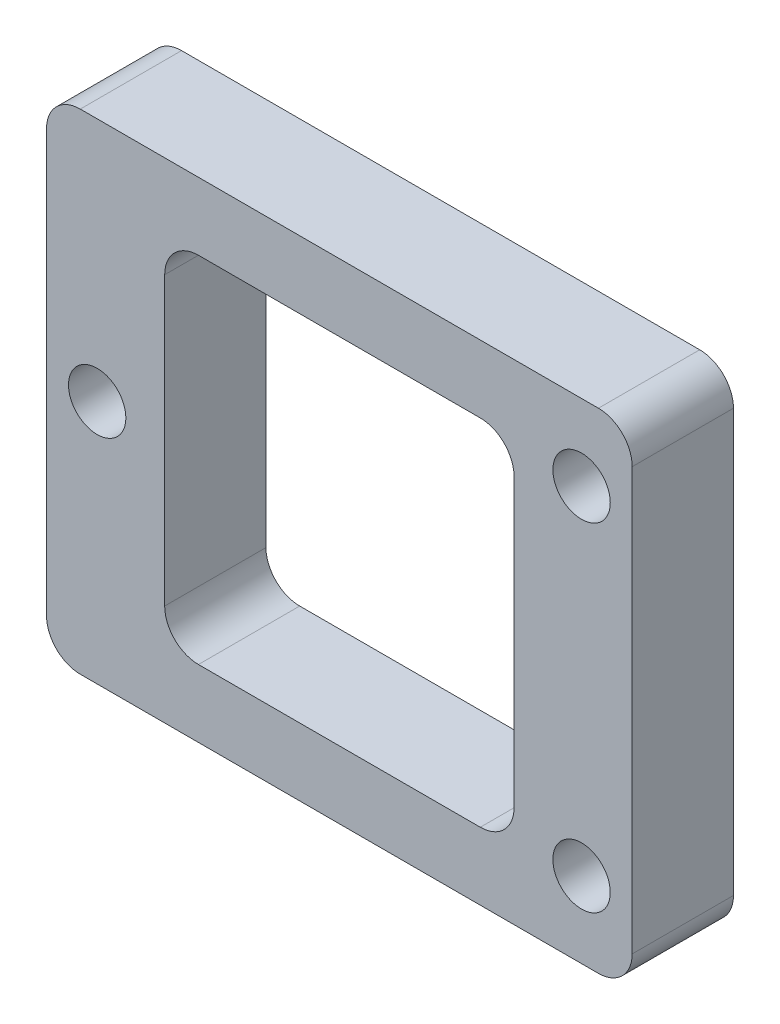
ISO-10303-21;
HEADER;
FILE_DESCRIPTION(('STEP AP214'),'2;1');
FILE_NAME('part.step','',(''),(''),'','','');
FILE_SCHEMA(('AUTOMOTIVE_DESIGN { 1 0 10303 214 1 1 1 1 }'));
ENDSEC;
DATA;
#1=APPLICATION_CONTEXT('core data for automotive mechanical design processes');
#2=APPLICATION_PROTOCOL_DEFINITION('international standard','automotive_design',2000,#1);
#3=PRODUCT_CONTEXT('',#1,'mechanical');
#4=PRODUCT('Part','Part','',(#3));
#5=PRODUCT_RELATED_PRODUCT_CATEGORY('part','',(#4));
#6=PRODUCT_DEFINITION_FORMATION('','',#4);
#7=PRODUCT_DEFINITION_CONTEXT('part definition',#1,'design');
#8=PRODUCT_DEFINITION('design','',#6,#7);
#9=PRODUCT_DEFINITION_SHAPE('','',#8);
#10=(LENGTH_UNIT() NAMED_UNIT(*) SI_UNIT(.MILLI.,.METRE.));
#11=(NAMED_UNIT(*) PLANE_ANGLE_UNIT() SI_UNIT($,.RADIAN.));
#12=(NAMED_UNIT(*) SI_UNIT($,.STERADIAN.) SOLID_ANGLE_UNIT());
#13=UNCERTAINTY_MEASURE_WITH_UNIT(LENGTH_MEASURE(1.E-05),#10,'distance_accuracy_value','');
#14=(GEOMETRIC_REPRESENTATION_CONTEXT(3) GLOBAL_UNCERTAINTY_ASSIGNED_CONTEXT((#13)) GLOBAL_UNIT_ASSIGNED_CONTEXT((#10,
#11,#12)) REPRESENTATION_CONTEXT('',''));
#15=CARTESIAN_POINT('',(0.,0.,0.));
#16=DIRECTION('',(0.,0.,1.));
#17=DIRECTION('',(1.,0.,0.));
#18=AXIS2_PLACEMENT_3D('',#15,#16,#17);
#19=CARTESIAN_POINT('',(17.35,-14.5,6.));
#20=DIRECTION('',(-1.,0.,0.));
#21=DIRECTION('',(0.,0.,1.));
#22=AXIS2_PLACEMENT_3D('',#19,#20,#21);
#23=PLANE('',#22);
#24=DIRECTION('',(0.,1.,0.));
#25=VECTOR('',#24,1.);
#26=CARTESIAN_POINT('',(17.35,-14.5,6.));
#27=LINE('',#26,#25);
#28=CARTESIAN_POINT('',(17.35,-12.5,6.));
#29=VERTEX_POINT('',#28);
#30=CARTESIAN_POINT('',(17.35,12.5,6.));
#31=VERTEX_POINT('',#30);
#32=EDGE_CURVE('E241',#29,#31,#27,.T.);
#33=ORIENTED_EDGE('',*,*,#32,.F.);
#34=DIRECTION('',(0.,0.,-1.));
#35=VECTOR('',#34,1.);
#36=CARTESIAN_POINT('',(17.35,-12.5,6.));
#37=LINE('',#36,#35);
#38=CARTESIAN_POINT('',(17.35,-12.5,0.));
#39=VERTEX_POINT('',#38);
#40=EDGE_CURVE('E183',#29,#39,#37,.T.);
#41=ORIENTED_EDGE('',*,*,#40,.T.);
#42=DIRECTION('',(0.,1.,0.));
#43=VECTOR('',#42,1.);
#44=CARTESIAN_POINT('',(17.35,-14.5,0.));
#45=LINE('',#44,#43);
#46=CARTESIAN_POINT('',(17.35,12.5,0.));
#47=VERTEX_POINT('',#46);
#48=EDGE_CURVE('E231',#39,#47,#45,.T.);
#49=ORIENTED_EDGE('',*,*,#48,.T.);
#50=DIRECTION('',(0.,0.,-1.));
#51=VECTOR('',#50,1.);
#52=CARTESIAN_POINT('',(17.35,12.5,6.));
#53=LINE('',#52,#51);
#54=EDGE_CURVE('E180',#47,#31,#53,.F.);
#55=ORIENTED_EDGE('',*,*,#54,.T.);
#56=EDGE_LOOP('',(#33,#41,#49,#55));
#57=FACE_BOUND('',#56,.T.);
#58=ADVANCED_FACE('F35',(#57),#23,.F.);
#59=CARTESIAN_POINT('',(-17.35,14.5,6.));
#60=DIRECTION('',(0.,-1.,0.));
#61=DIRECTION('',(0.,0.,-1.));
#62=AXIS2_PLACEMENT_3D('',#59,#60,#61);
#63=PLANE('',#62);
#64=DIRECTION('',(-1.,0.,0.));
#65=VECTOR('',#64,1.);
#66=CARTESIAN_POINT('',(-17.35,14.5,0.));
#67=LINE('',#66,#65);
#68=CARTESIAN_POINT('',(15.35,14.5,0.));
#69=VERTEX_POINT('',#68);
#70=CARTESIAN_POINT('',(-15.35,14.5,0.));
#71=VERTEX_POINT('',#70);
#72=EDGE_CURVE('E221',#69,#71,#67,.T.);
#73=ORIENTED_EDGE('',*,*,#72,.T.);
#74=DIRECTION('',(0.,0.,-1.));
#75=VECTOR('',#74,1.);
#76=CARTESIAN_POINT('',(-15.35,14.5,6.));
#77=LINE('',#76,#75);
#78=CARTESIAN_POINT('',(-15.35,14.5,6.));
#79=VERTEX_POINT('',#78);
#80=EDGE_CURVE('E11',#71,#79,#77,.F.);
#81=ORIENTED_EDGE('',*,*,#80,.T.);
#82=DIRECTION('',(-1.,0.,0.));
#83=VECTOR('',#82,1.);
#84=CARTESIAN_POINT('',(-17.35,14.5,6.));
#85=LINE('',#84,#83);
#86=CARTESIAN_POINT('',(15.35,14.5,6.));
#87=VERTEX_POINT('',#86);
#88=EDGE_CURVE('E223',#87,#79,#85,.T.);
#89=ORIENTED_EDGE('',*,*,#88,.F.);
#90=DIRECTION('',(0.,0.,-1.));
#91=VECTOR('',#90,1.);
#92=CARTESIAN_POINT('',(15.35,14.5,6.));
#93=LINE('',#92,#91);
#94=EDGE_CURVE('E43',#87,#69,#93,.T.);
#95=ORIENTED_EDGE('',*,*,#94,.T.);
#96=EDGE_LOOP('',(#73,#81,#89,#95));
#97=FACE_BOUND('',#96,.T.);
#98=ADVANCED_FACE('F220',(#97),#63,.F.);
#99=CARTESIAN_POINT('',(-17.35,-14.5,6.));
#100=DIRECTION('',(1.,0.,0.));
#101=DIRECTION('',(0.,0.,-1.));
#102=AXIS2_PLACEMENT_3D('',#99,#100,#101);
#103=PLANE('',#102);
#104=DIRECTION('',(0.,-1.,0.));
#105=VECTOR('',#104,1.);
#106=CARTESIAN_POINT('',(-17.35,-14.5,0.));
#107=LINE('',#106,#105);
#108=CARTESIAN_POINT('',(-17.35,12.5,0.));
#109=VERTEX_POINT('',#108);
#110=CARTESIAN_POINT('',(-17.35,-12.5,0.));
#111=VERTEX_POINT('',#110);
#112=EDGE_CURVE('E230',#109,#111,#107,.T.);
#113=ORIENTED_EDGE('',*,*,#112,.T.);
#114=DIRECTION('',(0.,0.,-1.));
#115=VECTOR('',#114,1.);
#116=CARTESIAN_POINT('',(-17.35,-12.5,6.));
#117=LINE('',#116,#115);
#118=CARTESIAN_POINT('',(-17.35,-12.5,6.));
#119=VERTEX_POINT('',#118);
#120=EDGE_CURVE('E50',#111,#119,#117,.F.);
#121=ORIENTED_EDGE('',*,*,#120,.T.);
#122=DIRECTION('',(0.,-1.,0.));
#123=VECTOR('',#122,1.);
#124=CARTESIAN_POINT('',(-17.35,-14.5,6.));
#125=LINE('',#124,#123);
#126=CARTESIAN_POINT('',(-17.35,12.5,6.));
#127=VERTEX_POINT('',#126);
#128=EDGE_CURVE('E316',#127,#119,#125,.T.);
#129=ORIENTED_EDGE('',*,*,#128,.F.);
#130=DIRECTION('',(0.,0.,-1.));
#131=VECTOR('',#130,1.);
#132=CARTESIAN_POINT('',(-17.35,12.5,6.));
#133=LINE('',#132,#131);
#134=EDGE_CURVE('E211',#127,#109,#133,.T.);
#135=ORIENTED_EDGE('',*,*,#134,.T.);
#136=EDGE_LOOP('',(#113,#121,#129,#135));
#137=FACE_BOUND('',#136,.T.);
#138=ADVANCED_FACE('F334',(#137),#103,.F.);
#139=CARTESIAN_POINT('',(-17.35,-14.5,6.));
#140=DIRECTION('',(0.,1.,0.));
#141=DIRECTION('',(0.,0.,1.));
#142=AXIS2_PLACEMENT_3D('',#139,#140,#141);
#143=PLANE('',#142);
#144=DIRECTION('',(1.,0.,0.));
#145=VECTOR('',#144,1.);
#146=CARTESIAN_POINT('',(-17.35,-14.5,0.));
#147=LINE('',#146,#145);
#148=CARTESIAN_POINT('',(-15.35,-14.5,0.));
#149=VERTEX_POINT('',#148);
#150=CARTESIAN_POINT('',(15.35,-14.5,0.));
#151=VERTEX_POINT('',#150);
#152=EDGE_CURVE('E233',#149,#151,#147,.T.);
#153=ORIENTED_EDGE('',*,*,#152,.T.);
#154=DIRECTION('',(0.,0.,-1.));
#155=VECTOR('',#154,1.);
#156=CARTESIAN_POINT('',(15.35,-14.5,6.));
#157=LINE('',#156,#155);
#158=CARTESIAN_POINT('',(15.35,-14.5,6.));
#159=VERTEX_POINT('',#158);
#160=EDGE_CURVE('E202',#151,#159,#157,.F.);
#161=ORIENTED_EDGE('',*,*,#160,.T.);
#162=DIRECTION('',(1.,0.,0.));
#163=VECTOR('',#162,1.);
#164=CARTESIAN_POINT('',(-17.35,-14.5,6.));
#165=LINE('',#164,#163);
#166=CARTESIAN_POINT('',(-15.35,-14.5,6.));
#167=VERTEX_POINT('',#166);
#168=EDGE_CURVE('E252',#167,#159,#165,.T.);
#169=ORIENTED_EDGE('',*,*,#168,.F.);
#170=DIRECTION('',(0.,0.,-1.));
#171=VECTOR('',#170,1.);
#172=CARTESIAN_POINT('',(-15.35,-14.5,6.));
#173=LINE('',#172,#171);
#174=EDGE_CURVE('E199',#167,#149,#173,.T.);
#175=ORIENTED_EDGE('',*,*,#174,.T.);
#176=EDGE_LOOP('',(#153,#161,#169,#175));
#177=FACE_BOUND('',#176,.T.);
#178=ADVANCED_FACE('F331',(#177),#143,.F.);
#179=CARTESIAN_POINT('',(0.,0.,6.));
#180=DIRECTION('',(0.,0.,-1.));
#181=DIRECTION('',(-1.,0.,0.));
#182=AXIS2_PLACEMENT_3D('',#179,#180,#181);
#183=PLANE('',#182);
#184=DIRECTION('',(-1.,0.,0.));
#185=VECTOR('',#184,1.);
#186=CARTESIAN_POINT('',(-10.35,10.5,6.));
#187=LINE('',#186,#185);
#188=CARTESIAN_POINT('',(8.35,10.5,6.));
#189=VERTEX_POINT('',#188);
#190=CARTESIAN_POINT('',(-8.35,10.5,6.));
#191=VERTEX_POINT('',#190);
#192=EDGE_CURVE('E305',#189,#191,#187,.T.);
#193=ORIENTED_EDGE('',*,*,#192,.F.);
#194=CARTESIAN_POINT('',(8.35,8.5,6.));
#195=DIRECTION('',(0.,0.,-1.));
#196=DIRECTION('',(-1.,0.,0.));
#197=AXIS2_PLACEMENT_3D('',#194,#195,#196);
#198=CIRCLE('',#197,2.);
#199=CARTESIAN_POINT('',(10.35,8.5,6.));
#200=VERTEX_POINT('',#199);
#201=EDGE_CURVE('E274',#189,#200,#198,.T.);
#202=ORIENTED_EDGE('',*,*,#201,.T.);
#203=DIRECTION('',(0.,1.,0.));
#204=VECTOR('',#203,1.);
#205=CARTESIAN_POINT('',(10.35,-10.5,6.));
#206=LINE('',#205,#204);
#207=CARTESIAN_POINT('',(10.35,-8.5,6.));
#208=VERTEX_POINT('',#207);
#209=EDGE_CURVE('E297',#208,#200,#206,.T.);
#210=ORIENTED_EDGE('',*,*,#209,.F.);
#211=CARTESIAN_POINT('',(8.35,-8.5,6.));
#212=DIRECTION('',(0.,0.,-1.));
#213=DIRECTION('',(-1.,0.,0.));
#214=AXIS2_PLACEMENT_3D('',#211,#212,#213);
#215=CIRCLE('',#214,2.);
#216=CARTESIAN_POINT('',(8.35,-10.5,6.));
#217=VERTEX_POINT('',#216);
#218=EDGE_CURVE('E278',#208,#217,#215,.T.);
#219=ORIENTED_EDGE('',*,*,#218,.T.);
#220=DIRECTION('',(1.,0.,0.));
#221=VECTOR('',#220,1.);
#222=CARTESIAN_POINT('',(-10.35,-10.5,6.));
#223=LINE('',#222,#221);
#224=CARTESIAN_POINT('',(-8.35,-10.5,6.));
#225=VERTEX_POINT('',#224);
#226=EDGE_CURVE('E296',#225,#217,#223,.T.);
#227=ORIENTED_EDGE('',*,*,#226,.F.);
#228=CARTESIAN_POINT('',(-8.35,-8.5,6.));
#229=DIRECTION('',(0.,0.,-1.));
#230=DIRECTION('',(-1.,0.,0.));
#231=AXIS2_PLACEMENT_3D('',#228,#229,#230);
#232=CIRCLE('',#231,2.);
#233=CARTESIAN_POINT('',(-10.35,-8.5,6.));
#234=VERTEX_POINT('',#233);
#235=EDGE_CURVE('E181',#225,#234,#232,.T.);
#236=ORIENTED_EDGE('',*,*,#235,.T.);
#237=DIRECTION('',(0.,-1.,0.));
#238=VECTOR('',#237,1.);
#239=CARTESIAN_POINT('',(-10.35,-10.5,6.));
#240=LINE('',#239,#238);
#241=CARTESIAN_POINT('',(-10.35,8.5,6.));
#242=VERTEX_POINT('',#241);
#243=EDGE_CURVE('E157',#242,#234,#240,.T.);
#244=ORIENTED_EDGE('',*,*,#243,.F.);
#245=CARTESIAN_POINT('',(-8.35,8.5,6.));
#246=DIRECTION('',(0.,0.,-1.));
#247=DIRECTION('',(-1.,0.,0.));
#248=AXIS2_PLACEMENT_3D('',#245,#246,#247);
#249=CIRCLE('',#248,2.);
#250=EDGE_CURVE('E271',#242,#191,#249,.T.);
#251=ORIENTED_EDGE('',*,*,#250,.T.);
#252=EDGE_LOOP('',(#193,#202,#210,#219,#227,#236,#244,#251));
#253=FACE_BOUND('',#252,.T.);
#254=CARTESIAN_POINT('',(14.35,-9.99999999999999,6.));
#255=DIRECTION('',(0.,0.,1.));
#256=DIRECTION('',(1.,0.,0.));
#257=AXIS2_PLACEMENT_3D('',#254,#255,#256);
#258=CIRCLE('',#257,1.7);
#259=CARTESIAN_POINT('',(16.05,-9.99999999999999,6.));
#260=VERTEX_POINT('',#259);
#261=EDGE_CURVE('E246',#260,#260,#258,.T.);
#262=ORIENTED_EDGE('',*,*,#261,.F.);
#263=EDGE_LOOP('',(#262));
#264=FACE_BOUND('',#263,.T.);
#265=CARTESIAN_POINT('',(-14.35,0.,6.));
#266=DIRECTION('',(0.,0.,1.));
#267=DIRECTION('',(1.,0.,0.));
#268=AXIS2_PLACEMENT_3D('',#265,#266,#267);
#269=CIRCLE('',#268,1.7);
#270=CARTESIAN_POINT('',(-12.65,0.,6.));
#271=VERTEX_POINT('',#270);
#272=EDGE_CURVE('E303',#271,#271,#269,.T.);
#273=ORIENTED_EDGE('',*,*,#272,.F.);
#274=EDGE_LOOP('',(#273));
#275=FACE_BOUND('',#274,.T.);
#276=CARTESIAN_POINT('',(14.35,10.,6.));
#277=DIRECTION('',(0.,0.,1.));
#278=DIRECTION('',(1.,0.,0.));
#279=AXIS2_PLACEMENT_3D('',#276,#277,#278);
#280=CIRCLE('',#279,1.7);
#281=CARTESIAN_POINT('',(16.05,10.,6.));
#282=VERTEX_POINT('',#281);
#283=EDGE_CURVE('E300',#282,#282,#280,.T.);
#284=ORIENTED_EDGE('',*,*,#283,.F.);
#285=EDGE_LOOP('',(#284));
#286=FACE_BOUND('',#285,.T.);
#287=ORIENTED_EDGE('',*,*,#168,.T.);
#288=CARTESIAN_POINT('',(15.35,-12.5,6.));
#289=DIRECTION('',(0.,0.,-1.));
#290=DIRECTION('',(-1.,0.,0.));
#291=AXIS2_PLACEMENT_3D('',#288,#289,#290);
#292=CIRCLE('',#291,2.);
#293=EDGE_CURVE('E209',#159,#29,#292,.F.);
#294=ORIENTED_EDGE('',*,*,#293,.T.);
#295=ORIENTED_EDGE('',*,*,#32,.T.);
#296=CARTESIAN_POINT('',(15.35,12.5,6.));
#297=DIRECTION('',(0.,0.,-1.));
#298=DIRECTION('',(-1.,0.,0.));
#299=AXIS2_PLACEMENT_3D('',#296,#297,#298);
#300=CIRCLE('',#299,2.);
#301=EDGE_CURVE('E204',#31,#87,#300,.F.);
#302=ORIENTED_EDGE('',*,*,#301,.T.);
#303=ORIENTED_EDGE('',*,*,#88,.T.);
#304=CARTESIAN_POINT('',(-15.35,12.5,6.));
#305=DIRECTION('',(0.,0.,-1.));
#306=DIRECTION('',(-1.,0.,0.));
#307=AXIS2_PLACEMENT_3D('',#304,#305,#306);
#308=CIRCLE('',#307,2.);
#309=EDGE_CURVE('E57',#79,#127,#308,.F.);
#310=ORIENTED_EDGE('',*,*,#309,.T.);
#311=ORIENTED_EDGE('',*,*,#128,.T.);
#312=CARTESIAN_POINT('',(-15.35,-12.5,6.));
#313=DIRECTION('',(0.,0.,-1.));
#314=DIRECTION('',(-1.,0.,0.));
#315=AXIS2_PLACEMENT_3D('',#312,#313,#314);
#316=CIRCLE('',#315,2.);
#317=EDGE_CURVE('E207',#119,#167,#316,.F.);
#318=ORIENTED_EDGE('',*,*,#317,.T.);
#319=EDGE_LOOP('',(#287,#294,#295,#302,#303,#310,#311,#318));
#320=FACE_BOUND('',#319,.T.);
#321=ADVANCED_FACE('F294',(#253,#264,#275,#286,#320),#183,.F.);
#322=CARTESIAN_POINT('',(0.,0.,0.));
#323=DIRECTION('',(0.,0.,-1.));
#324=DIRECTION('',(-1.,0.,0.));
#325=AXIS2_PLACEMENT_3D('',#322,#323,#324);
#326=PLANE('',#325);
#327=DIRECTION('',(0.,-1.,0.));
#328=VECTOR('',#327,1.);
#329=CARTESIAN_POINT('',(10.35,0.,0.));
#330=LINE('',#329,#328);
#331=CARTESIAN_POINT('',(10.35,8.5,0.));
#332=VERTEX_POINT('',#331);
#333=CARTESIAN_POINT('',(10.35,-8.5,0.));
#334=VERTEX_POINT('',#333);
#335=EDGE_CURVE('E161',#332,#334,#330,.T.);
#336=ORIENTED_EDGE('',*,*,#335,.F.);
#337=CARTESIAN_POINT('',(8.35,8.5,0.));
#338=DIRECTION('',(0.,0.,-1.));
#339=DIRECTION('',(-1.,0.,0.));
#340=AXIS2_PLACEMENT_3D('',#337,#338,#339);
#341=CIRCLE('',#340,2.);
#342=CARTESIAN_POINT('',(8.35,10.5,0.));
#343=VERTEX_POINT('',#342);
#344=EDGE_CURVE('E276',#332,#343,#341,.F.);
#345=ORIENTED_EDGE('',*,*,#344,.T.);
#346=DIRECTION('',(1.,0.,0.));
#347=VECTOR('',#346,1.);
#348=CARTESIAN_POINT('',(0.,10.5,0.));
#349=LINE('',#348,#347);
#350=CARTESIAN_POINT('',(-8.35,10.5,0.));
#351=VERTEX_POINT('',#350);
#352=EDGE_CURVE('E174',#351,#343,#349,.T.);
#353=ORIENTED_EDGE('',*,*,#352,.F.);
#354=CARTESIAN_POINT('',(-8.35,8.5,0.));
#355=DIRECTION('',(0.,0.,-1.));
#356=DIRECTION('',(-1.,0.,0.));
#357=AXIS2_PLACEMENT_3D('',#354,#355,#356);
#358=CIRCLE('',#357,2.);
#359=CARTESIAN_POINT('',(-10.35,8.5,0.));
#360=VERTEX_POINT('',#359);
#361=EDGE_CURVE('E172',#351,#360,#358,.F.);
#362=ORIENTED_EDGE('',*,*,#361,.T.);
#363=DIRECTION('',(0.,1.,0.));
#364=VECTOR('',#363,1.);
#365=CARTESIAN_POINT('',(-10.35,0.,0.));
#366=LINE('',#365,#364);
#367=CARTESIAN_POINT('',(-10.35,-8.5,0.));
#368=VERTEX_POINT('',#367);
#369=EDGE_CURVE('E154',#368,#360,#366,.T.);
#370=ORIENTED_EDGE('',*,*,#369,.F.);
#371=CARTESIAN_POINT('',(-8.35,-8.5,0.));
#372=DIRECTION('',(0.,0.,-1.));
#373=DIRECTION('',(-1.,0.,0.));
#374=AXIS2_PLACEMENT_3D('',#371,#372,#373);
#375=CIRCLE('',#374,2.);
#376=CARTESIAN_POINT('',(-8.35,-10.5,0.));
#377=VERTEX_POINT('',#376);
#378=EDGE_CURVE('E168',#368,#377,#375,.F.);
#379=ORIENTED_EDGE('',*,*,#378,.T.);
#380=DIRECTION('',(-1.,0.,0.));
#381=VECTOR('',#380,1.);
#382=CARTESIAN_POINT('',(0.,-10.5,0.));
#383=LINE('',#382,#381);
#384=CARTESIAN_POINT('',(8.35,-10.5,0.));
#385=VERTEX_POINT('',#384);
#386=EDGE_CURVE('E173',#385,#377,#383,.T.);
#387=ORIENTED_EDGE('',*,*,#386,.F.);
#388=CARTESIAN_POINT('',(8.35,-8.5,0.));
#389=DIRECTION('',(0.,0.,-1.));
#390=DIRECTION('',(-1.,0.,0.));
#391=AXIS2_PLACEMENT_3D('',#388,#389,#390);
#392=CIRCLE('',#391,2.);
#393=EDGE_CURVE('E185',#385,#334,#392,.F.);
#394=ORIENTED_EDGE('',*,*,#393,.T.);
#395=EDGE_LOOP('',(#336,#345,#353,#362,#370,#379,#387,#394));
#396=FACE_BOUND('',#395,.T.);
#397=CARTESIAN_POINT('',(14.35,-9.99999999999999,0.));
#398=DIRECTION('',(0.,0.,-1.));
#399=DIRECTION('',(-1.,0.,0.));
#400=AXIS2_PLACEMENT_3D('',#397,#398,#399);
#401=CIRCLE('',#400,1.7);
#402=CARTESIAN_POINT('',(12.65,-9.99999999999999,0.));
#403=VERTEX_POINT('',#402);
#404=EDGE_CURVE('E235',#403,#403,#401,.T.);
#405=ORIENTED_EDGE('',*,*,#404,.F.);
#406=EDGE_LOOP('',(#405));
#407=FACE_BOUND('',#406,.T.);
#408=CARTESIAN_POINT('',(-14.35,0.,0.));
#409=DIRECTION('',(0.,0.,-1.));
#410=DIRECTION('',(-1.,0.,0.));
#411=AXIS2_PLACEMENT_3D('',#408,#409,#410);
#412=CIRCLE('',#411,1.7);
#413=CARTESIAN_POINT('',(-16.05,0.,0.));
#414=VERTEX_POINT('',#413);
#415=EDGE_CURVE('E245',#414,#414,#412,.T.);
#416=ORIENTED_EDGE('',*,*,#415,.F.);
#417=EDGE_LOOP('',(#416));
#418=FACE_BOUND('',#417,.T.);
#419=CARTESIAN_POINT('',(14.35,10.,0.));
#420=DIRECTION('',(0.,0.,-1.));
#421=DIRECTION('',(-1.,0.,0.));
#422=AXIS2_PLACEMENT_3D('',#419,#420,#421);
#423=CIRCLE('',#422,1.7);
#424=CARTESIAN_POINT('',(12.65,10.,0.));
#425=VERTEX_POINT('',#424);
#426=EDGE_CURVE('E242',#425,#425,#423,.T.);
#427=ORIENTED_EDGE('',*,*,#426,.F.);
#428=EDGE_LOOP('',(#427));
#429=FACE_BOUND('',#428,.T.);
#430=ORIENTED_EDGE('',*,*,#48,.F.);
#431=CARTESIAN_POINT('',(15.35,-12.5,0.));
#432=DIRECTION('',(0.,0.,-1.));
#433=DIRECTION('',(-1.,0.,0.));
#434=AXIS2_PLACEMENT_3D('',#431,#432,#433);
#435=CIRCLE('',#434,2.);
#436=EDGE_CURVE('E197',#39,#151,#435,.T.);
#437=ORIENTED_EDGE('',*,*,#436,.T.);
#438=ORIENTED_EDGE('',*,*,#152,.F.);
#439=CARTESIAN_POINT('',(-15.35,-12.5,0.));
#440=DIRECTION('',(0.,0.,-1.));
#441=DIRECTION('',(-1.,0.,0.));
#442=AXIS2_PLACEMENT_3D('',#439,#440,#441);
#443=CIRCLE('',#442,2.);
#444=EDGE_CURVE('E195',#149,#111,#443,.T.);
#445=ORIENTED_EDGE('',*,*,#444,.T.);
#446=ORIENTED_EDGE('',*,*,#112,.F.);
#447=CARTESIAN_POINT('',(-15.35,12.5,0.));
#448=DIRECTION('',(0.,0.,-1.));
#449=DIRECTION('',(-1.,0.,0.));
#450=AXIS2_PLACEMENT_3D('',#447,#448,#449);
#451=CIRCLE('',#450,2.);
#452=EDGE_CURVE('E193',#109,#71,#451,.T.);
#453=ORIENTED_EDGE('',*,*,#452,.T.);
#454=ORIENTED_EDGE('',*,*,#72,.F.);
#455=CARTESIAN_POINT('',(15.35,12.5,0.));
#456=DIRECTION('',(0.,0.,-1.));
#457=DIRECTION('',(-1.,0.,0.));
#458=AXIS2_PLACEMENT_3D('',#455,#456,#457);
#459=CIRCLE('',#458,2.);
#460=EDGE_CURVE('E191',#69,#47,#459,.T.);
#461=ORIENTED_EDGE('',*,*,#460,.T.);
#462=EDGE_LOOP('',(#430,#437,#438,#445,#446,#453,#454,#461));
#463=FACE_BOUND('',#462,.T.);
#464=ADVANCED_FACE('F165',(#396,#407,#418,#429,#463),#326,.T.);
#465=CARTESIAN_POINT('',(14.35,10.,-19.));
#466=DIRECTION('',(0.,0.,1.));
#467=DIRECTION('',(1.,0.,0.));
#468=AXIS2_PLACEMENT_3D('',#465,#466,#467);
#469=CYLINDRICAL_SURFACE('',#468,1.7);
#470=ORIENTED_EDGE('',*,*,#426,.T.);
#471=EDGE_LOOP('',(#470));
#472=FACE_BOUND('',#471,.T.);
#473=ORIENTED_EDGE('',*,*,#283,.T.);
#474=EDGE_LOOP('',(#473));
#475=FACE_BOUND('',#474,.T.);
#476=ADVANCED_FACE('F454',(#472,#475),#469,.F.);
#477=CARTESIAN_POINT('',(-14.35,0.,-19.));
#478=DIRECTION('',(0.,0.,1.));
#479=DIRECTION('',(1.,0.,0.));
#480=AXIS2_PLACEMENT_3D('',#477,#478,#479);
#481=CYLINDRICAL_SURFACE('',#480,1.7);
#482=ORIENTED_EDGE('',*,*,#415,.T.);
#483=EDGE_LOOP('',(#482));
#484=FACE_BOUND('',#483,.T.);
#485=ORIENTED_EDGE('',*,*,#272,.T.);
#486=EDGE_LOOP('',(#485));
#487=FACE_BOUND('',#486,.T.);
#488=ADVANCED_FACE('F445',(#484,#487),#481,.F.);
#489=CARTESIAN_POINT('',(14.35,-9.99999999999999,-19.));
#490=DIRECTION('',(0.,0.,1.));
#491=DIRECTION('',(1.,0.,0.));
#492=AXIS2_PLACEMENT_3D('',#489,#490,#491);
#493=CYLINDRICAL_SURFACE('',#492,1.7);
#494=ORIENTED_EDGE('',*,*,#404,.T.);
#495=EDGE_LOOP('',(#494));
#496=FACE_BOUND('',#495,.T.);
#497=ORIENTED_EDGE('',*,*,#261,.T.);
#498=EDGE_LOOP('',(#497));
#499=FACE_BOUND('',#498,.T.);
#500=ADVANCED_FACE('F437',(#496,#499),#493,.F.);
#501=CARTESIAN_POINT('',(10.35,-10.5,-4.));
#502=DIRECTION('',(1.,0.,0.));
#503=DIRECTION('',(0.,1.,0.));
#504=AXIS2_PLACEMENT_3D('',#501,#502,#503);
#505=PLANE('',#504);
#506=ORIENTED_EDGE('',*,*,#209,.T.);
#507=DIRECTION('',(0.,0.,1.));
#508=VECTOR('',#507,1.);
#509=CARTESIAN_POINT('',(10.35,8.5,0.));
#510=LINE('',#509,#508);
#511=EDGE_CURVE('E266',#200,#332,#510,.F.);
#512=ORIENTED_EDGE('',*,*,#511,.T.);
#513=ORIENTED_EDGE('',*,*,#335,.T.);
#514=DIRECTION('',(0.,0.,1.));
#515=VECTOR('',#514,1.);
#516=CARTESIAN_POINT('',(10.35,-8.5,6.));
#517=LINE('',#516,#515);
#518=EDGE_CURVE('E263',#334,#208,#517,.T.);
#519=ORIENTED_EDGE('',*,*,#518,.T.);
#520=EDGE_LOOP('',(#506,#512,#513,#519));
#521=FACE_BOUND('',#520,.T.);
#522=ADVANCED_FACE('F286',(#521),#505,.F.);
#523=CARTESIAN_POINT('',(-10.35,-10.5,-4.));
#524=DIRECTION('',(0.,-1.,0.));
#525=DIRECTION('',(0.,0.,-1.));
#526=AXIS2_PLACEMENT_3D('',#523,#524,#525);
#527=PLANE('',#526);
#528=ORIENTED_EDGE('',*,*,#226,.T.);
#529=DIRECTION('',(0.,0.,1.));
#530=VECTOR('',#529,1.);
#531=CARTESIAN_POINT('',(8.35,-10.5,0.));
#532=LINE('',#531,#530);
#533=EDGE_CURVE('E269',#217,#385,#532,.F.);
#534=ORIENTED_EDGE('',*,*,#533,.T.);
#535=ORIENTED_EDGE('',*,*,#386,.T.);
#536=DIRECTION('',(0.,0.,1.));
#537=VECTOR('',#536,1.);
#538=CARTESIAN_POINT('',(-8.35,-10.5,6.));
#539=LINE('',#538,#537);
#540=EDGE_CURVE('E179',#377,#225,#539,.T.);
#541=ORIENTED_EDGE('',*,*,#540,.T.);
#542=EDGE_LOOP('',(#528,#534,#535,#541));
#543=FACE_BOUND('',#542,.T.);
#544=ADVANCED_FACE('F299',(#543),#527,.F.);
#545=CARTESIAN_POINT('',(-10.35,-10.5,-4.));
#546=DIRECTION('',(-1.,0.,0.));
#547=DIRECTION('',(0.,0.,1.));
#548=AXIS2_PLACEMENT_3D('',#545,#546,#547);
#549=PLANE('',#548);
#550=ORIENTED_EDGE('',*,*,#369,.T.);
#551=DIRECTION('',(0.,0.,1.));
#552=VECTOR('',#551,1.);
#553=CARTESIAN_POINT('',(-10.35,8.5,6.));
#554=LINE('',#553,#552);
#555=EDGE_CURVE('E160',#360,#242,#554,.T.);
#556=ORIENTED_EDGE('',*,*,#555,.T.);
#557=ORIENTED_EDGE('',*,*,#243,.T.);
#558=DIRECTION('',(0.,0.,1.));
#559=VECTOR('',#558,1.);
#560=CARTESIAN_POINT('',(-10.35,-8.5,0.));
#561=LINE('',#560,#559);
#562=EDGE_CURVE('E150',#234,#368,#561,.F.);
#563=ORIENTED_EDGE('',*,*,#562,.T.);
#564=EDGE_LOOP('',(#550,#556,#557,#563));
#565=FACE_BOUND('',#564,.T.);
#566=ADVANCED_FACE('F152',(#565),#549,.F.);
#567=CARTESIAN_POINT('',(-10.35,10.5,-4.));
#568=DIRECTION('',(0.,1.,0.));
#569=DIRECTION('',(0.,0.,1.));
#570=AXIS2_PLACEMENT_3D('',#567,#568,#569);
#571=PLANE('',#570);
#572=ORIENTED_EDGE('',*,*,#192,.T.);
#573=DIRECTION('',(0.,0.,1.));
#574=VECTOR('',#573,1.);
#575=CARTESIAN_POINT('',(-8.35,10.5,0.));
#576=LINE('',#575,#574);
#577=EDGE_CURVE('E261',#191,#351,#576,.F.);
#578=ORIENTED_EDGE('',*,*,#577,.T.);
#579=ORIENTED_EDGE('',*,*,#352,.T.);
#580=DIRECTION('',(0.,0.,1.));
#581=VECTOR('',#580,1.);
#582=CARTESIAN_POINT('',(8.35,10.5,6.));
#583=LINE('',#582,#581);
#584=EDGE_CURVE('E258',#343,#189,#583,.T.);
#585=ORIENTED_EDGE('',*,*,#584,.T.);
#586=EDGE_LOOP('',(#572,#578,#579,#585));
#587=FACE_BOUND('',#586,.T.);
#588=ADVANCED_FACE('F354',(#587),#571,.F.);
#589=CARTESIAN_POINT('',(-8.35,8.5,-4.));
#590=DIRECTION('',(0.,0.,-1.));
#591=DIRECTION('',(-1.,0.,0.));
#592=AXIS2_PLACEMENT_3D('',#589,#590,#591);
#593=CYLINDRICAL_SURFACE('',#592,2.);
#594=ORIENTED_EDGE('',*,*,#361,.F.);
#595=ORIENTED_EDGE('',*,*,#577,.F.);
#596=ORIENTED_EDGE('',*,*,#250,.F.);
#597=ORIENTED_EDGE('',*,*,#555,.F.);
#598=EDGE_LOOP('',(#594,#595,#596,#597));
#599=FACE_BOUND('',#598,.T.);
#600=ADVANCED_FACE('F350',(#599),#593,.F.);
#601=CARTESIAN_POINT('',(8.35,8.5,-4.));
#602=DIRECTION('',(0.,0.,-1.));
#603=DIRECTION('',(-1.,0.,0.));
#604=AXIS2_PLACEMENT_3D('',#601,#602,#603);
#605=CYLINDRICAL_SURFACE('',#604,2.);
#606=ORIENTED_EDGE('',*,*,#344,.F.);
#607=ORIENTED_EDGE('',*,*,#511,.F.);
#608=ORIENTED_EDGE('',*,*,#201,.F.);
#609=ORIENTED_EDGE('',*,*,#584,.F.);
#610=EDGE_LOOP('',(#606,#607,#608,#609));
#611=FACE_BOUND('',#610,.T.);
#612=ADVANCED_FACE('F353',(#611),#605,.F.);
#613=CARTESIAN_POINT('',(8.35,-8.5,-4.));
#614=DIRECTION('',(0.,0.,-1.));
#615=DIRECTION('',(-1.,0.,0.));
#616=AXIS2_PLACEMENT_3D('',#613,#614,#615);
#617=CYLINDRICAL_SURFACE('',#616,2.);
#618=ORIENTED_EDGE('',*,*,#393,.F.);
#619=ORIENTED_EDGE('',*,*,#533,.F.);
#620=ORIENTED_EDGE('',*,*,#218,.F.);
#621=ORIENTED_EDGE('',*,*,#518,.F.);
#622=EDGE_LOOP('',(#618,#619,#620,#621));
#623=FACE_BOUND('',#622,.T.);
#624=ADVANCED_FACE('F289',(#623),#617,.F.);
#625=CARTESIAN_POINT('',(-8.35,-8.5,-4.));
#626=DIRECTION('',(0.,0.,-1.));
#627=DIRECTION('',(-1.,0.,0.));
#628=AXIS2_PLACEMENT_3D('',#625,#626,#627);
#629=CYLINDRICAL_SURFACE('',#628,2.);
#630=ORIENTED_EDGE('',*,*,#378,.F.);
#631=ORIENTED_EDGE('',*,*,#562,.F.);
#632=ORIENTED_EDGE('',*,*,#235,.F.);
#633=ORIENTED_EDGE('',*,*,#540,.F.);
#634=EDGE_LOOP('',(#630,#631,#632,#633));
#635=FACE_BOUND('',#634,.T.);
#636=ADVANCED_FACE('F177',(#635),#629,.F.);
#637=CARTESIAN_POINT('',(15.35,-12.5,6.));
#638=DIRECTION('',(0.,0.,-1.));
#639=DIRECTION('',(-1.,0.,0.));
#640=AXIS2_PLACEMENT_3D('',#637,#638,#639);
#641=CYLINDRICAL_SURFACE('',#640,2.);
#642=ORIENTED_EDGE('',*,*,#293,.F.);
#643=ORIENTED_EDGE('',*,*,#160,.F.);
#644=ORIENTED_EDGE('',*,*,#436,.F.);
#645=ORIENTED_EDGE('',*,*,#40,.F.);
#646=EDGE_LOOP('',(#642,#643,#644,#645));
#647=FACE_BOUND('',#646,.T.);
#648=ADVANCED_FACE('F327',(#647),#641,.T.);
#649=CARTESIAN_POINT('',(-15.35,-12.5,6.));
#650=DIRECTION('',(0.,0.,-1.));
#651=DIRECTION('',(-1.,0.,0.));
#652=AXIS2_PLACEMENT_3D('',#649,#650,#651);
#653=CYLINDRICAL_SURFACE('',#652,2.);
#654=ORIENTED_EDGE('',*,*,#317,.F.);
#655=ORIENTED_EDGE('',*,*,#120,.F.);
#656=ORIENTED_EDGE('',*,*,#444,.F.);
#657=ORIENTED_EDGE('',*,*,#174,.F.);
#658=EDGE_LOOP('',(#654,#655,#656,#657));
#659=FACE_BOUND('',#658,.T.);
#660=ADVANCED_FACE('F333',(#659),#653,.T.);
#661=CARTESIAN_POINT('',(-15.35,12.5,6.));
#662=DIRECTION('',(0.,0.,-1.));
#663=DIRECTION('',(-1.,0.,0.));
#664=AXIS2_PLACEMENT_3D('',#661,#662,#663);
#665=CYLINDRICAL_SURFACE('',#664,2.);
#666=ORIENTED_EDGE('',*,*,#309,.F.);
#667=ORIENTED_EDGE('',*,*,#80,.F.);
#668=ORIENTED_EDGE('',*,*,#452,.F.);
#669=ORIENTED_EDGE('',*,*,#134,.F.);
#670=EDGE_LOOP('',(#666,#667,#668,#669));
#671=FACE_BOUND('',#670,.T.);
#672=ADVANCED_FACE('F337',(#671),#665,.T.);
#673=CARTESIAN_POINT('',(15.35,12.5,6.));
#674=DIRECTION('',(0.,0.,-1.));
#675=DIRECTION('',(-1.,0.,0.));
#676=AXIS2_PLACEMENT_3D('',#673,#674,#675);
#677=CYLINDRICAL_SURFACE('',#676,2.);
#678=ORIENTED_EDGE('',*,*,#301,.F.);
#679=ORIENTED_EDGE('',*,*,#54,.F.);
#680=ORIENTED_EDGE('',*,*,#460,.F.);
#681=ORIENTED_EDGE('',*,*,#94,.F.);
#682=EDGE_LOOP('',(#678,#679,#680,#681));
#683=FACE_BOUND('',#682,.T.);
#684=ADVANCED_FACE('F37',(#683),#677,.T.);
#685=CLOSED_SHELL('',(#58,#98,#138,#178,#321,#464,#476,#488,#500,#522,#544,#566,#588,#600,#612,
#624,#636,#648,#660,#672,#684));
#686=MANIFOLD_SOLID_BREP('B2',#685);
#687=ADVANCED_BREP_SHAPE_REPRESENTATION('',(#18,#686),#14);
#688=SHAPE_DEFINITION_REPRESENTATION(#9,#687);
ENDSEC;
END-ISO-10303-21;
